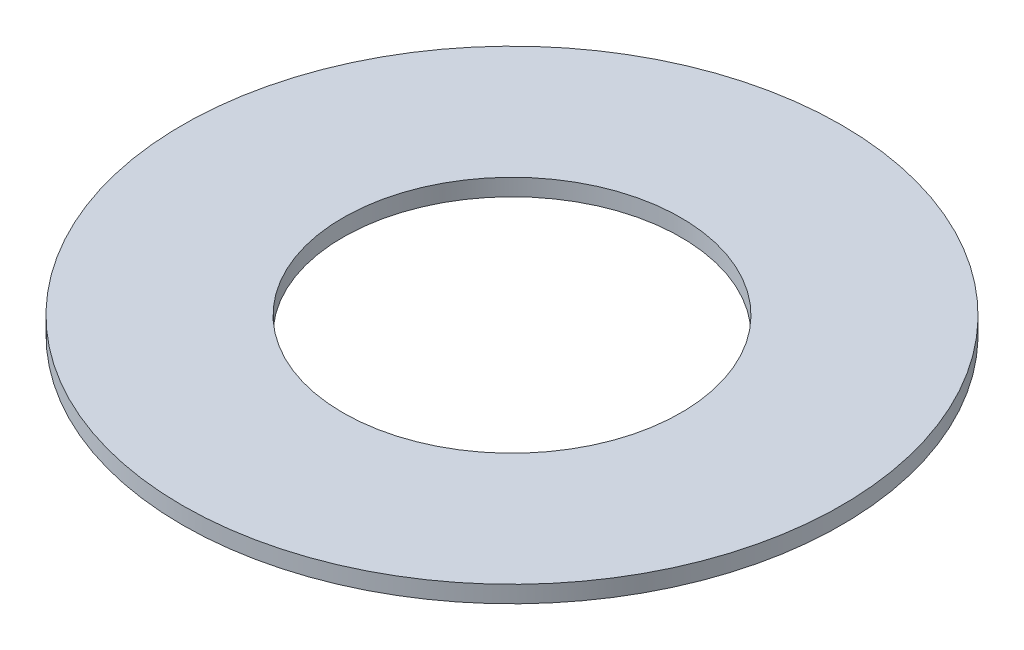
ISO-10303-21;
HEADER;
FILE_DESCRIPTION(('STEP AP214'),'2;1');
FILE_NAME('part.step','',(''),(''),'','','');
FILE_SCHEMA(('AUTOMOTIVE_DESIGN { 1 0 10303 214 1 1 1 1 }'));
ENDSEC;
DATA;
#1=APPLICATION_CONTEXT('core data for automotive mechanical design processes');
#2=APPLICATION_PROTOCOL_DEFINITION('international standard','automotive_design',2000,#1);
#3=PRODUCT_CONTEXT('',#1,'mechanical');
#4=PRODUCT('Part','Part','',(#3));
#5=PRODUCT_RELATED_PRODUCT_CATEGORY('part','',(#4));
#6=PRODUCT_DEFINITION_FORMATION('','',#4);
#7=PRODUCT_DEFINITION_CONTEXT('part definition',#1,'design');
#8=PRODUCT_DEFINITION('design','',#6,#7);
#9=PRODUCT_DEFINITION_SHAPE('','',#8);
#10=(LENGTH_UNIT() NAMED_UNIT(*) SI_UNIT(.MILLI.,.METRE.));
#11=(NAMED_UNIT(*) PLANE_ANGLE_UNIT() SI_UNIT($,.RADIAN.));
#12=(NAMED_UNIT(*) SI_UNIT($,.STERADIAN.) SOLID_ANGLE_UNIT());
#13=UNCERTAINTY_MEASURE_WITH_UNIT(LENGTH_MEASURE(1.E-05),#10,'distance_accuracy_value','');
#14=(GEOMETRIC_REPRESENTATION_CONTEXT(3) GLOBAL_UNCERTAINTY_ASSIGNED_CONTEXT((#13)) GLOBAL_UNIT_ASSIGNED_CONTEXT((#10,
#11,#12)) REPRESENTATION_CONTEXT('',''));
#15=CARTESIAN_POINT('',(0.,0.,0.));
#16=DIRECTION('',(0.,0.,1.));
#17=DIRECTION('',(1.,0.,0.));
#18=AXIS2_PLACEMENT_3D('',#15,#16,#17);
#19=CARTESIAN_POINT('',(0.,0.5,0.));
#20=DIRECTION('',(0.,1.,0.));
#21=DIRECTION('',(0.,0.,0.999999999999999));
#22=AXIS2_PLACEMENT_3D('',#19,#20,#21);
#23=PLANE('',#22);
#24=CARTESIAN_POINT('',(0.,0.5,0.));
#25=DIRECTION('',(0.,1.,0.));
#26=DIRECTION('',(0.,0.,0.999999999999999));
#27=AXIS2_PLACEMENT_3D('',#24,#25,#26);
#28=CIRCLE('',#27,9.75);
#29=CARTESIAN_POINT('',(0.,0.5,9.74999999999999));
#30=VERTEX_POINT('',#29);
#31=EDGE_CURVE('E10',#30,#30,#28,.T.);
#32=ORIENTED_EDGE('',*,*,#31,.T.);
#33=EDGE_LOOP('',(#32));
#34=FACE_BOUND('',#33,.T.);
#35=CARTESIAN_POINT('',(0.,0.5,0.));
#36=DIRECTION('',(0.,1.,0.));
#37=DIRECTION('',(0.,0.,0.999999999999999));
#38=AXIS2_PLACEMENT_3D('',#35,#36,#37);
#39=CIRCLE('',#38,5.);
#40=CARTESIAN_POINT('',(0.,0.5,5.));
#41=VERTEX_POINT('',#40);
#42=EDGE_CURVE('E44',#41,#41,#39,.T.);
#43=ORIENTED_EDGE('',*,*,#42,.F.);
#44=EDGE_LOOP('',(#43));
#45=FACE_BOUND('',#44,.T.);
#46=ADVANCED_FACE('F33',(#34,#45),#23,.T.);
#47=CARTESIAN_POINT('',(0.,0.,0.));
#48=DIRECTION('',(0.,1.,0.));
#49=DIRECTION('',(0.,0.,0.999999999999999));
#50=AXIS2_PLACEMENT_3D('',#47,#48,#49);
#51=PLANE('',#50);
#52=CARTESIAN_POINT('',(0.,0.,0.));
#53=DIRECTION('',(0.,1.,0.));
#54=DIRECTION('',(0.,0.,0.999999999999999));
#55=AXIS2_PLACEMENT_3D('',#52,#53,#54);
#56=CIRCLE('',#55,9.75);
#57=CARTESIAN_POINT('',(0.,0.,9.74999999999999));
#58=VERTEX_POINT('',#57);
#59=EDGE_CURVE('E37',#58,#58,#56,.T.);
#60=ORIENTED_EDGE('',*,*,#59,.F.);
#61=EDGE_LOOP('',(#60));
#62=FACE_BOUND('',#61,.T.);
#63=CARTESIAN_POINT('',(0.,0.,0.));
#64=DIRECTION('',(0.,1.,0.));
#65=DIRECTION('',(0.,0.,0.999999999999999));
#66=AXIS2_PLACEMENT_3D('',#63,#64,#65);
#67=CIRCLE('',#66,5.);
#68=CARTESIAN_POINT('',(0.,0.,5.));
#69=VERTEX_POINT('',#68);
#70=EDGE_CURVE('E46',#69,#69,#67,.T.);
#71=ORIENTED_EDGE('',*,*,#70,.T.);
#72=EDGE_LOOP('',(#71));
#73=FACE_BOUND('',#72,.T.);
#74=ADVANCED_FACE('F56',(#62,#73),#51,.F.);
#75=CARTESIAN_POINT('',(0.,0.5,0.));
#76=DIRECTION('',(0.,-1.,0.));
#77=DIRECTION('',(0.,0.,-0.999999999999999));
#78=AXIS2_PLACEMENT_3D('',#75,#76,#77);
#79=CYLINDRICAL_SURFACE('',#78,9.75);
#80=ORIENTED_EDGE('',*,*,#31,.F.);
#81=EDGE_LOOP('',(#80));
#82=FACE_BOUND('',#81,.T.);
#83=ORIENTED_EDGE('',*,*,#59,.T.);
#84=EDGE_LOOP('',(#83));
#85=FACE_BOUND('',#84,.T.);
#86=ADVANCED_FACE('F35',(#82,#85),#79,.T.);
#87=CARTESIAN_POINT('',(0.,0.5,0.));
#88=DIRECTION('',(0.,-1.,0.));
#89=DIRECTION('',(0.,0.,-0.999999999999999));
#90=AXIS2_PLACEMENT_3D('',#87,#88,#89);
#91=CYLINDRICAL_SURFACE('',#90,5.);
#92=ORIENTED_EDGE('',*,*,#42,.T.);
#93=EDGE_LOOP('',(#92));
#94=FACE_BOUND('',#93,.T.);
#95=ORIENTED_EDGE('',*,*,#70,.F.);
#96=EDGE_LOOP('',(#95));
#97=FACE_BOUND('',#96,.T.);
#98=ADVANCED_FACE('F52',(#94,#97),#91,.F.);
#99=CLOSED_SHELL('',(#46,#74,#86,#98));
#100=MANIFOLD_SOLID_BREP('B2',#99);
#101=ADVANCED_BREP_SHAPE_REPRESENTATION('',(#18,#100),#14);
#102=SHAPE_DEFINITION_REPRESENTATION(#9,#101);
ENDSEC;
END-ISO-10303-21;
